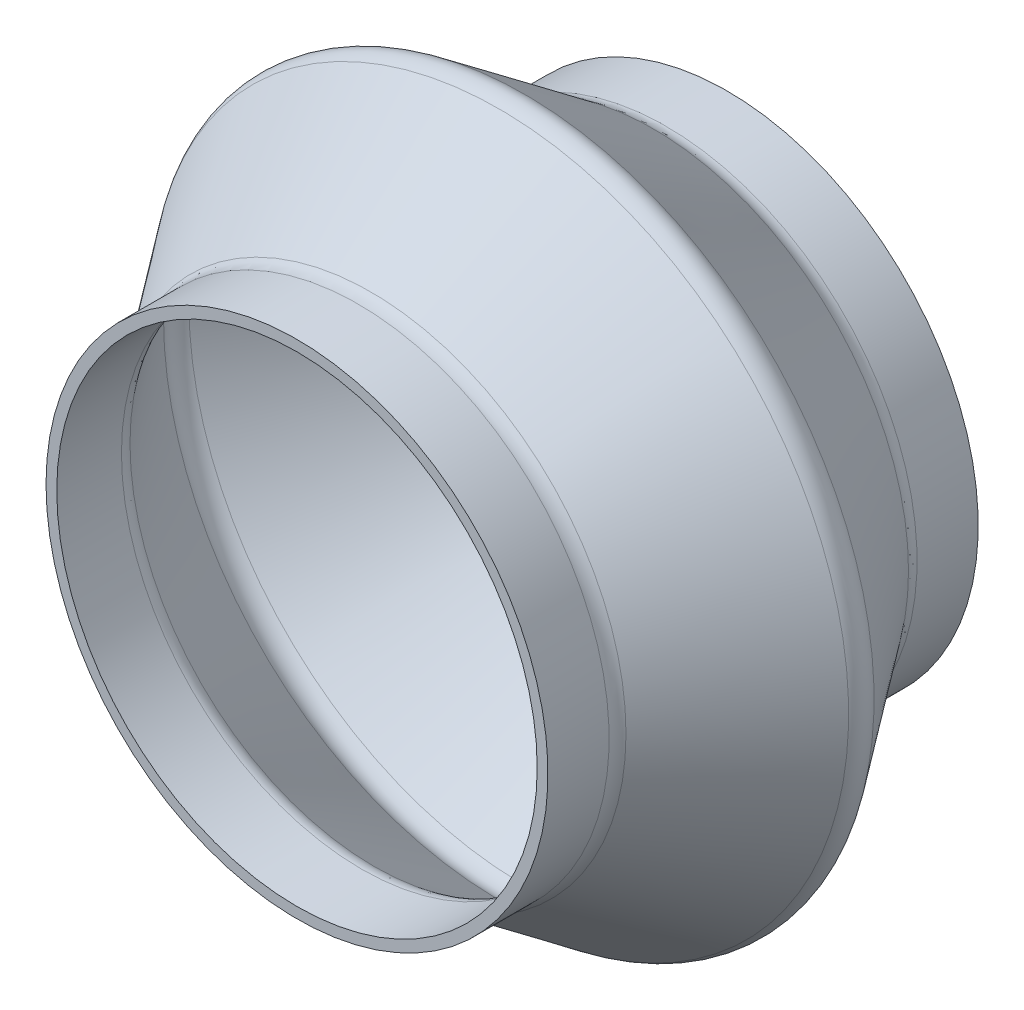
ISO-10303-21;
HEADER;
FILE_DESCRIPTION(('STEP AP214'),'2;1');
FILE_NAME('part.step','',(''),(''),'','','');
FILE_SCHEMA(('AUTOMOTIVE_DESIGN { 1 0 10303 214 1 1 1 1 }'));
ENDSEC;
DATA;
#1=APPLICATION_CONTEXT('core data for automotive mechanical design processes');
#2=APPLICATION_PROTOCOL_DEFINITION('international standard','automotive_design',2000,#1);
#3=PRODUCT_CONTEXT('',#1,'mechanical');
#4=PRODUCT('Part','Part','',(#3));
#5=PRODUCT_RELATED_PRODUCT_CATEGORY('part','',(#4));
#6=PRODUCT_DEFINITION_FORMATION('','',#4);
#7=PRODUCT_DEFINITION_CONTEXT('part definition',#1,'design');
#8=PRODUCT_DEFINITION('design','',#6,#7);
#9=PRODUCT_DEFINITION_SHAPE('','',#8);
#10=(LENGTH_UNIT() NAMED_UNIT(*) SI_UNIT(.MILLI.,.METRE.));
#11=(NAMED_UNIT(*) PLANE_ANGLE_UNIT() SI_UNIT($,.RADIAN.));
#12=(NAMED_UNIT(*) SI_UNIT($,.STERADIAN.) SOLID_ANGLE_UNIT());
#13=UNCERTAINTY_MEASURE_WITH_UNIT(LENGTH_MEASURE(1.E-05),#10,'distance_accuracy_value','');
#14=(GEOMETRIC_REPRESENTATION_CONTEXT(3) GLOBAL_UNCERTAINTY_ASSIGNED_CONTEXT((#13)) GLOBAL_UNIT_ASSIGNED_CONTEXT((#10,
#11,#12)) REPRESENTATION_CONTEXT('',''));
#15=CARTESIAN_POINT('',(0.,0.,0.));
#16=DIRECTION('',(0.,0.,1.));
#17=DIRECTION('',(1.,0.,0.));
#18=AXIS2_PLACEMENT_3D('',#15,#16,#17);
#19=CARTESIAN_POINT('',(-35.,0.,-60.));
#20=DIRECTION('',(0.,0.,-1.));
#21=DIRECTION('',(-1.,0.,0.));
#22=AXIS2_PLACEMENT_3D('',#19,#20,#21);
#23=PLANE('',#22);
#24=CARTESIAN_POINT('',(0.,0.,-60.));
#25=DIRECTION('',(0.,0.,-1.));
#26=DIRECTION('',(-1.,0.,0.));
#27=AXIS2_PLACEMENT_3D('',#24,#25,#26);
#28=CIRCLE('',#27,35.);
#29=CARTESIAN_POINT('',(-35.,0.,-60.));
#30=VERTEX_POINT('',#29);
#31=EDGE_CURVE('E104',#30,#30,#28,.T.);
#32=ORIENTED_EDGE('',*,*,#31,.T.);
#33=EDGE_LOOP('',(#32));
#34=FACE_BOUND('',#33,.T.);
#35=CARTESIAN_POINT('',(0.,0.,-60.));
#36=DIRECTION('',(0.,0.,-1.));
#37=DIRECTION('',(-1.,0.,0.));
#38=AXIS2_PLACEMENT_3D('',#35,#36,#37);
#39=CIRCLE('',#38,33.5);
#40=CARTESIAN_POINT('',(-33.5,0.,-60.));
#41=VERTEX_POINT('',#40);
#42=EDGE_CURVE('E10',#41,#41,#39,.T.);
#43=ORIENTED_EDGE('',*,*,#42,.F.);
#44=EDGE_LOOP('',(#43));
#45=FACE_BOUND('',#44,.T.);
#46=ADVANCED_FACE('F37',(#34,#45),#23,.T.);
#47=CARTESIAN_POINT('',(0.,0.,-72.5469958651825));
#48=DIRECTION('',(0.,0.,-1.));
#49=DIRECTION('',(-1.,0.,0.));
#50=AXIS2_PLACEMENT_3D('',#47,#48,#49);
#51=CYLINDRICAL_SURFACE('',#50,33.5);
#52=ORIENTED_EDGE('',*,*,#42,.T.);
#53=EDGE_LOOP('',(#52));
#54=FACE_BOUND('',#53,.T.);
#55=CARTESIAN_POINT('',(0.,0.,-50.980726368515));
#56=DIRECTION('',(0.,0.,-1.));
#57=DIRECTION('',(-1.,0.,0.));
#58=AXIS2_PLACEMENT_3D('',#55,#56,#57);
#59=CIRCLE('',#58,33.5);
#60=CARTESIAN_POINT('',(-33.5,0.,-50.980726368515));
#61=VERTEX_POINT('',#60);
#62=EDGE_CURVE('E44',#61,#61,#59,.T.);
#63=ORIENTED_EDGE('',*,*,#62,.F.);
#64=EDGE_LOOP('',(#63));
#65=FACE_BOUND('',#64,.T.);
#66=ADVANCED_FACE('F123',(#54,#65),#51,.F.);
#67=CARTESIAN_POINT('',(0.,0.,-50.980726368515));
#68=DIRECTION('',(0.,0.,-1.));
#69=DIRECTION('',(-1.,0.,0.));
#70=AXIS2_PLACEMENT_3D('',#67,#68,#69);
#71=TOROIDAL_SURFACE('',#70,36.5,3.);
#72=ORIENTED_EDGE('',*,*,#62,.T.);
#73=EDGE_LOOP('',(#72));
#74=FACE_BOUND('',#73,.T.);
#75=CARTESIAN_POINT('',(0.,0.,-49.2086538784459));
#76=DIRECTION('',(0.,0.,-1.));
#77=DIRECTION('',(-1.,0.,0.));
#78=AXIS2_PLACEMENT_3D('',#75,#76,#77);
#79=CIRCLE('',#78,34.0793060726435);
#80=CARTESIAN_POINT('',(-34.0793060726435,0.,-49.2086538784459));
#81=VERTEX_POINT('',#80);
#82=EDGE_CURVE('E49',#81,#81,#79,.T.);
#83=ORIENTED_EDGE('',*,*,#82,.F.);
#84=EDGE_LOOP('',(#83));
#85=FACE_BOUND('',#84,.T.);
#86=ADVANCED_FACE('F127',(#74,#85),#71,.T.);
#87=CARTESIAN_POINT('',(0.,0.,-31.7720724900691));
#88=DIRECTION('',(0.,0.,1.));
#89=DIRECTION('',(1.,0.,0.));
#90=AXIS2_PLACEMENT_3D('',#87,#88,#89);
#91=CONICAL_SURFACE('',#90,46.8437806929176,0.631914728108052);
#92=ORIENTED_EDGE('',*,*,#82,.T.);
#93=EDGE_LOOP('',(#92));
#94=FACE_BOUND('',#93,.T.);
#95=CARTESIAN_POINT('',(0.,0.,-31.7720724900691));
#96=DIRECTION('',(0.,0.,-1.));
#97=DIRECTION('',(-1.,0.,0.));
#98=AXIS2_PLACEMENT_3D('',#95,#96,#97);
#99=CIRCLE('',#98,46.8437806929176);
#100=CARTESIAN_POINT('',(-46.8437806929176,0.,-31.7720724900691));
#101=VERTEX_POINT('',#100);
#102=EDGE_CURVE('E54',#101,#101,#99,.T.);
#103=ORIENTED_EDGE('',*,*,#102,.F.);
#104=EDGE_LOOP('',(#103));
#105=FACE_BOUND('',#104,.T.);
#106=ADVANCED_FACE('F131',(#94,#105),#91,.F.);
#107=CARTESIAN_POINT('',(0.,0.,-30.));
#108=DIRECTION('',(0.,0.,-1.));
#109=DIRECTION('',(-1.,0.,0.));
#110=AXIS2_PLACEMENT_3D('',#107,#108,#109);
#111=TOROIDAL_SURFACE('',#110,44.4230867655611,3.);
#112=ORIENTED_EDGE('',*,*,#102,.T.);
#113=EDGE_LOOP('',(#112));
#114=FACE_BOUND('',#113,.T.);
#115=CARTESIAN_POINT('',(0.,0.,-28.2279275099309));
#116=DIRECTION('',(0.,0.,-1.));
#117=DIRECTION('',(-1.,0.,0.));
#118=AXIS2_PLACEMENT_3D('',#115,#116,#117);
#119=CIRCLE('',#118,46.8437806929176);
#120=CARTESIAN_POINT('',(-46.8437806929176,0.,-28.2279275099309));
#121=VERTEX_POINT('',#120);
#122=EDGE_CURVE('E60',#121,#121,#119,.T.);
#123=ORIENTED_EDGE('',*,*,#122,.F.);
#124=EDGE_LOOP('',(#123));
#125=FACE_BOUND('',#124,.T.);
#126=ADVANCED_FACE('F137',(#114,#125),#111,.F.);
#127=CARTESIAN_POINT('',(0.,0.,-10.7913461215541));
#128=DIRECTION('',(0.,0.,-1.));
#129=DIRECTION('',(-1.,0.,0.));
#130=AXIS2_PLACEMENT_3D('',#127,#128,#129);
#131=CONICAL_SURFACE('',#130,34.0793060726436,0.631914728108052);
#132=ORIENTED_EDGE('',*,*,#122,.T.);
#133=EDGE_LOOP('',(#132));
#134=FACE_BOUND('',#133,.T.);
#135=CARTESIAN_POINT('',(0.,0.,-10.7913461215541));
#136=DIRECTION('',(0.,0.,-1.));
#137=DIRECTION('',(-1.,0.,0.));
#138=AXIS2_PLACEMENT_3D('',#135,#136,#137);
#139=CIRCLE('',#138,34.0793060726436);
#140=CARTESIAN_POINT('',(-34.0793060726436,0.,-10.7913461215541));
#141=VERTEX_POINT('',#140);
#142=EDGE_CURVE('E64',#141,#141,#139,.T.);
#143=ORIENTED_EDGE('',*,*,#142,.F.);
#144=EDGE_LOOP('',(#143));
#145=FACE_BOUND('',#144,.T.);
#146=ADVANCED_FACE('F141',(#134,#145),#131,.F.);
#147=CARTESIAN_POINT('',(0.,0.,-9.01927363148507));
#148=DIRECTION('',(0.,0.,-1.));
#149=DIRECTION('',(-1.,0.,0.));
#150=AXIS2_PLACEMENT_3D('',#147,#148,#149);
#151=TOROIDAL_SURFACE('',#150,36.5,3.);
#152=ORIENTED_EDGE('',*,*,#142,.T.);
#153=EDGE_LOOP('',(#152));
#154=FACE_BOUND('',#153,.T.);
#155=CARTESIAN_POINT('',(0.,0.,-9.01927363148507));
#156=DIRECTION('',(0.,0.,-1.));
#157=DIRECTION('',(-1.,0.,0.));
#158=AXIS2_PLACEMENT_3D('',#155,#156,#157);
#159=CIRCLE('',#158,33.5);
#160=CARTESIAN_POINT('',(-33.5,0.,-9.01927363148507));
#161=VERTEX_POINT('',#160);
#162=EDGE_CURVE('E68',#161,#161,#159,.T.);
#163=ORIENTED_EDGE('',*,*,#162,.F.);
#164=EDGE_LOOP('',(#163));
#165=FACE_BOUND('',#164,.T.);
#166=ADVANCED_FACE('F145',(#154,#165),#151,.T.);
#167=CARTESIAN_POINT('',(0.,0.,-72.5469958651825));
#168=DIRECTION('',(0.,0.,-1.));
#169=DIRECTION('',(-1.,0.,0.));
#170=AXIS2_PLACEMENT_3D('',#167,#168,#169);
#171=CYLINDRICAL_SURFACE('',#170,33.5);
#172=ORIENTED_EDGE('',*,*,#162,.T.);
#173=EDGE_LOOP('',(#172));
#174=FACE_BOUND('',#173,.T.);
#175=CARTESIAN_POINT('',(0.,0.,0.));
#176=DIRECTION('',(0.,0.,-1.));
#177=DIRECTION('',(-1.,0.,0.));
#178=AXIS2_PLACEMENT_3D('',#175,#176,#177);
#179=CIRCLE('',#178,33.5);
#180=CARTESIAN_POINT('',(-33.5,0.,0.));
#181=VERTEX_POINT('',#180);
#182=EDGE_CURVE('E72',#181,#181,#179,.T.);
#183=ORIENTED_EDGE('',*,*,#182,.F.);
#184=EDGE_LOOP('',(#183));
#185=FACE_BOUND('',#184,.T.);
#186=ADVANCED_FACE('F149',(#174,#185),#171,.F.);
#187=CARTESIAN_POINT('',(-33.5,0.,0.));
#188=DIRECTION('',(0.,0.,1.));
#189=DIRECTION('',(1.,0.,0.));
#190=AXIS2_PLACEMENT_3D('',#187,#188,#189);
#191=PLANE('',#190);
#192=ORIENTED_EDGE('',*,*,#182,.T.);
#193=EDGE_LOOP('',(#192));
#194=FACE_BOUND('',#193,.T.);
#195=CARTESIAN_POINT('',(0.,0.,0.));
#196=DIRECTION('',(0.,0.,-1.));
#197=DIRECTION('',(-1.,0.,0.));
#198=AXIS2_PLACEMENT_3D('',#195,#196,#197);
#199=CIRCLE('',#198,35.);
#200=CARTESIAN_POINT('',(-35.,0.,0.));
#201=VERTEX_POINT('',#200);
#202=EDGE_CURVE('E76',#201,#201,#199,.T.);
#203=ORIENTED_EDGE('',*,*,#202,.F.);
#204=EDGE_LOOP('',(#203));
#205=FACE_BOUND('',#204,.T.);
#206=ADVANCED_FACE('F153',(#194,#205),#191,.T.);
#207=CARTESIAN_POINT('',(0.,0.,-72.5469958651825));
#208=DIRECTION('',(0.,0.,-1.));
#209=DIRECTION('',(-1.,0.,0.));
#210=AXIS2_PLACEMENT_3D('',#207,#208,#209);
#211=CYLINDRICAL_SURFACE('',#210,35.);
#212=ORIENTED_EDGE('',*,*,#202,.T.);
#213=EDGE_LOOP('',(#212));
#214=FACE_BOUND('',#213,.T.);
#215=CARTESIAN_POINT('',(0.,0.,-8.52891044722759));
#216=DIRECTION('',(0.,0.,-1.));
#217=DIRECTION('',(-1.,0.,0.));
#218=AXIS2_PLACEMENT_3D('',#215,#216,#217);
#219=CIRCLE('',#218,35.);
#220=CARTESIAN_POINT('',(-35.,0.,-8.52891044722759));
#221=VERTEX_POINT('',#220);
#222=EDGE_CURVE('E80',#221,#221,#219,.T.);
#223=ORIENTED_EDGE('',*,*,#222,.F.);
#224=EDGE_LOOP('',(#223));
#225=FACE_BOUND('',#224,.T.);
#226=ADVANCED_FACE('F157',(#214,#225),#211,.T.);
#227=CARTESIAN_POINT('',(0.,0.,-8.5289104472276));
#228=DIRECTION('',(0.,0.,-1.));
#229=DIRECTION('',(-1.,0.,0.));
#230=AXIS2_PLACEMENT_3D('',#227,#228,#229);
#231=TOROIDAL_SURFACE('',#230,38.,3.);
#232=ORIENTED_EDGE('',*,*,#222,.T.);
#233=EDGE_LOOP('',(#232));
#234=FACE_BOUND('',#233,.T.);
#235=CARTESIAN_POINT('',(0.,0.,-10.3009829372967));
#236=DIRECTION('',(0.,0.,-1.));
#237=DIRECTION('',(-1.,0.,0.));
#238=AXIS2_PLACEMENT_3D('',#235,#236,#237);
#239=CIRCLE('',#238,35.5793060726435);
#240=CARTESIAN_POINT('',(-35.5793060726435,0.,-10.3009829372967));
#241=VERTEX_POINT('',#240);
#242=EDGE_CURVE('E84',#241,#241,#239,.T.);
#243=ORIENTED_EDGE('',*,*,#242,.F.);
#244=EDGE_LOOP('',(#243));
#245=FACE_BOUND('',#244,.T.);
#246=ADVANCED_FACE('F161',(#234,#245),#231,.F.);
#247=CARTESIAN_POINT('',(0.,0.,-28.2279275099309));
#248=DIRECTION('',(0.,0.,-1.));
#249=DIRECTION('',(-1.,0.,0.));
#250=AXIS2_PLACEMENT_3D('',#247,#248,#249);
#251=CONICAL_SURFACE('',#250,48.7027517710639,0.631914728108052);
#252=ORIENTED_EDGE('',*,*,#242,.T.);
#253=EDGE_LOOP('',(#252));
#254=FACE_BOUND('',#253,.T.);
#255=CARTESIAN_POINT('',(0.,0.,-28.2279275099309));
#256=DIRECTION('',(0.,0.,-1.));
#257=DIRECTION('',(-1.,0.,0.));
#258=AXIS2_PLACEMENT_3D('',#255,#256,#257);
#259=CIRCLE('',#258,48.7027517710639);
#260=CARTESIAN_POINT('',(-48.7027517710639,0.,-28.2279275099309));
#261=VERTEX_POINT('',#260);
#262=EDGE_CURVE('E88',#261,#261,#259,.T.);
#263=ORIENTED_EDGE('',*,*,#262,.F.);
#264=EDGE_LOOP('',(#263));
#265=FACE_BOUND('',#264,.T.);
#266=ADVANCED_FACE('F165',(#254,#265),#251,.T.);
#267=CARTESIAN_POINT('',(0.,0.,-30.));
#268=DIRECTION('',(0.,0.,-1.));
#269=DIRECTION('',(-1.,0.,0.));
#270=AXIS2_PLACEMENT_3D('',#267,#268,#269);
#271=TOROIDAL_SURFACE('',#270,46.2820578437074,3.);
#272=ORIENTED_EDGE('',*,*,#262,.T.);
#273=EDGE_LOOP('',(#272));
#274=FACE_BOUND('',#273,.T.);
#275=CARTESIAN_POINT('',(0.,0.,-31.7720724900691));
#276=DIRECTION('',(0.,0.,-1.));
#277=DIRECTION('',(-1.,0.,0.));
#278=AXIS2_PLACEMENT_3D('',#275,#276,#277);
#279=CIRCLE('',#278,48.7027517710639);
#280=CARTESIAN_POINT('',(-48.7027517710639,0.,-31.7720724900691));
#281=VERTEX_POINT('',#280);
#282=EDGE_CURVE('E92',#281,#281,#279,.T.);
#283=ORIENTED_EDGE('',*,*,#282,.F.);
#284=EDGE_LOOP('',(#283));
#285=FACE_BOUND('',#284,.T.);
#286=ADVANCED_FACE('F169',(#274,#285),#271,.T.);
#287=CARTESIAN_POINT('',(0.,0.,-49.6990170627033));
#288=DIRECTION('',(0.,0.,1.));
#289=DIRECTION('',(1.,0.,0.));
#290=AXIS2_PLACEMENT_3D('',#287,#288,#289);
#291=CONICAL_SURFACE('',#290,35.5793060726435,0.631914728108052);
#292=ORIENTED_EDGE('',*,*,#282,.T.);
#293=EDGE_LOOP('',(#292));
#294=FACE_BOUND('',#293,.T.);
#295=CARTESIAN_POINT('',(0.,0.,-49.6990170627033));
#296=DIRECTION('',(0.,0.,-1.));
#297=DIRECTION('',(-1.,0.,0.));
#298=AXIS2_PLACEMENT_3D('',#295,#296,#297);
#299=CIRCLE('',#298,35.5793060726435);
#300=CARTESIAN_POINT('',(-35.5793060726435,0.,-49.6990170627033));
#301=VERTEX_POINT('',#300);
#302=EDGE_CURVE('E96',#301,#301,#299,.T.);
#303=ORIENTED_EDGE('',*,*,#302,.F.);
#304=EDGE_LOOP('',(#303));
#305=FACE_BOUND('',#304,.T.);
#306=ADVANCED_FACE('F119',(#294,#305),#291,.T.);
#307=CARTESIAN_POINT('',(0.,0.,-51.4710895527724));
#308=DIRECTION('',(0.,0.,-1.));
#309=DIRECTION('',(-1.,0.,0.));
#310=AXIS2_PLACEMENT_3D('',#307,#308,#309);
#311=TOROIDAL_SURFACE('',#310,38.,3.);
#312=ORIENTED_EDGE('',*,*,#302,.T.);
#313=EDGE_LOOP('',(#312));
#314=FACE_BOUND('',#313,.T.);
#315=CARTESIAN_POINT('',(0.,0.,-51.4710895527724));
#316=DIRECTION('',(0.,0.,-1.));
#317=DIRECTION('',(-1.,0.,0.));
#318=AXIS2_PLACEMENT_3D('',#315,#316,#317);
#319=CIRCLE('',#318,35.);
#320=CARTESIAN_POINT('',(-35.,0.,-51.4710895527724));
#321=VERTEX_POINT('',#320);
#322=EDGE_CURVE('E100',#321,#321,#319,.T.);
#323=ORIENTED_EDGE('',*,*,#322,.F.);
#324=EDGE_LOOP('',(#323));
#325=FACE_BOUND('',#324,.T.);
#326=ADVANCED_FACE('F113',(#314,#325),#311,.F.);
#327=CARTESIAN_POINT('',(0.,0.,-72.5469958651825));
#328=DIRECTION('',(0.,0.,-1.));
#329=DIRECTION('',(-1.,0.,0.));
#330=AXIS2_PLACEMENT_3D('',#327,#328,#329);
#331=CYLINDRICAL_SURFACE('',#330,35.);
#332=ORIENTED_EDGE('',*,*,#322,.T.);
#333=EDGE_LOOP('',(#332));
#334=FACE_BOUND('',#333,.T.);
#335=ORIENTED_EDGE('',*,*,#31,.F.);
#336=EDGE_LOOP('',(#335));
#337=FACE_BOUND('',#336,.T.);
#338=ADVANCED_FACE('F111',(#334,#337),#331,.T.);
#339=CLOSED_SHELL('',(#46,#66,#86,#106,#126,#146,#166,#186,#206,#226,#246,#266,#286,#306,#326,#338));
#340=MANIFOLD_SOLID_BREP('B2',#339);
#341=ADVANCED_BREP_SHAPE_REPRESENTATION('',(#18,#340),#14);
#342=SHAPE_DEFINITION_REPRESENTATION(#9,#341);
ENDSEC;
END-ISO-10303-21;
